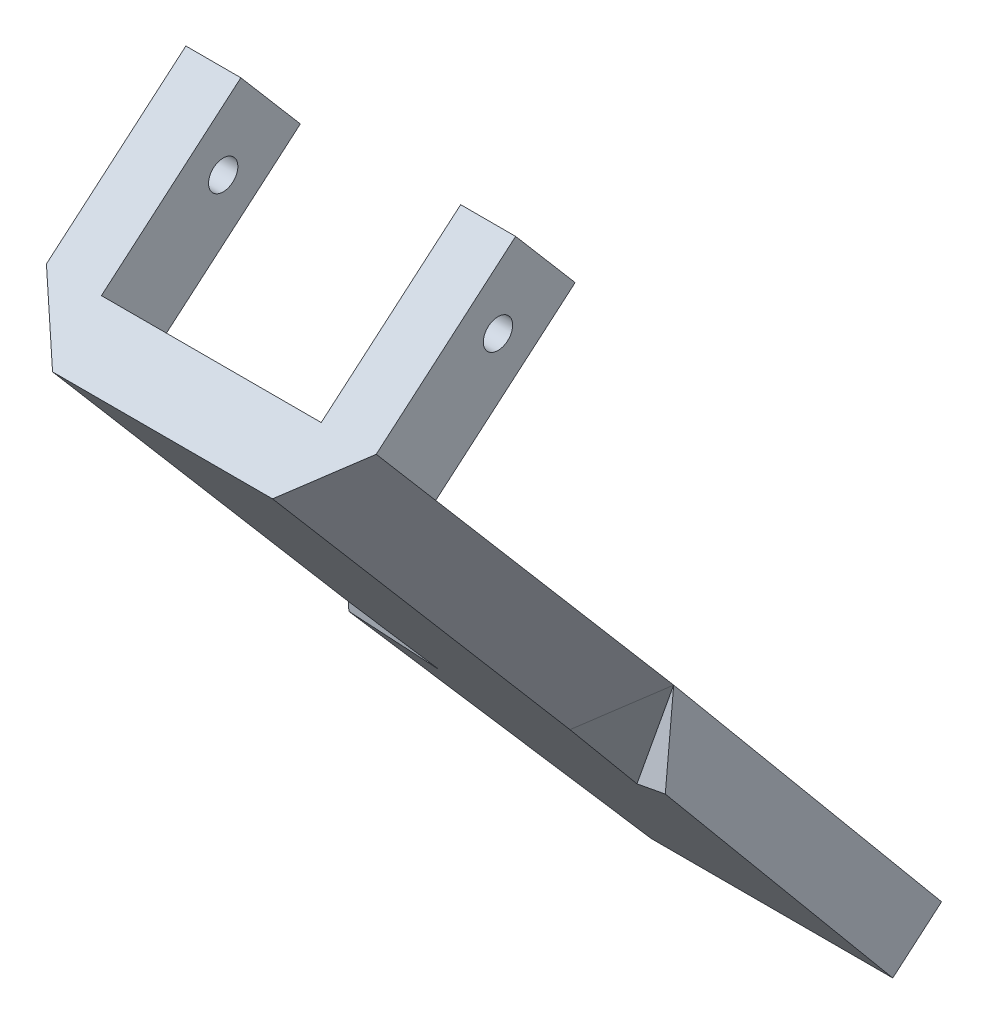
ISO-10303-21;
HEADER;
FILE_DESCRIPTION(('STEP AP214'),'2;1');
FILE_NAME('part.step','',(''),(''),'','','');
FILE_SCHEMA(('AUTOMOTIVE_DESIGN { 1 0 10303 214 1 1 1 1 }'));
ENDSEC;
DATA;
#1=APPLICATION_CONTEXT('core data for automotive mechanical design processes');
#2=APPLICATION_PROTOCOL_DEFINITION('international standard','automotive_design',2000,#1);
#3=PRODUCT_CONTEXT('',#1,'mechanical');
#4=PRODUCT('Part','Part','',(#3));
#5=PRODUCT_RELATED_PRODUCT_CATEGORY('part','',(#4));
#6=PRODUCT_DEFINITION_FORMATION('','',#4);
#7=PRODUCT_DEFINITION_CONTEXT('part definition',#1,'design');
#8=PRODUCT_DEFINITION('design','',#6,#7);
#9=PRODUCT_DEFINITION_SHAPE('','',#8);
#10=(LENGTH_UNIT() NAMED_UNIT(*) SI_UNIT(.MILLI.,.METRE.));
#11=(NAMED_UNIT(*) PLANE_ANGLE_UNIT() SI_UNIT($,.RADIAN.));
#12=(NAMED_UNIT(*) SI_UNIT($,.STERADIAN.) SOLID_ANGLE_UNIT());
#13=UNCERTAINTY_MEASURE_WITH_UNIT(LENGTH_MEASURE(1.E-05),#10,'distance_accuracy_value','');
#14=(GEOMETRIC_REPRESENTATION_CONTEXT(3) GLOBAL_UNCERTAINTY_ASSIGNED_CONTEXT((#13)) GLOBAL_UNIT_ASSIGNED_CONTEXT((#10,
#11,#12)) REPRESENTATION_CONTEXT('',''));
#15=CARTESIAN_POINT('',(0.,0.,0.));
#16=DIRECTION('',(0.,0.,1.));
#17=DIRECTION('',(1.,0.,0.));
#18=AXIS2_PLACEMENT_3D('',#15,#16,#17);
#19=CARTESIAN_POINT('',(2.25437314883265E-13,56.2791106650212,-65.9585803354128));
#20=DIRECTION('',(0.,0.649082267454743,-0.760718219892102));
#21=DIRECTION('',(0.,0.760718219892102,0.649082267454743));
#22=AXIS2_PLACEMENT_3D('',#19,#20,#21);
#23=PLANE('',#22);
#24=DIRECTION('',(1.,0.,0.));
#25=VECTOR('',#24,1.);
#26=CARTESIAN_POINT('',(-22.8498957354245,148.067169769134,12.3595142897139));
#27=LINE('',#26,#25);
#28=CARTESIAN_POINT('',(-22.8498957354245,148.067169769134,12.3595142897139));
#29=VERTEX_POINT('',#28);
#30=CARTESIAN_POINT('',(-15.2298957354245,148.067169769134,12.3595142897139));
#31=VERTEX_POINT('',#30);
#32=EDGE_CURVE('E173',#29,#31,#27,.T.);
#33=ORIENTED_EDGE('',*,*,#32,.T.);
#34=DIRECTION('',(0.,-0.760718219892102,-0.649082267454743));
#35=VECTOR('',#34,1.);
#36=CARTESIAN_POINT('',(-15.2298957354246,157.728291161764,20.6028590863891));
#37=LINE('',#36,#35);
#38=CARTESIAN_POINT('',(-15.2298957354246,157.728291161764,20.6028590863891));
#39=VERTEX_POINT('',#38);
#40=EDGE_CURVE('E162',#39,#31,#37,.T.);
#41=ORIENTED_EDGE('',*,*,#40,.F.);
#42=DIRECTION('',(-1.,0.,0.));
#43=VECTOR('',#42,1.);
#44=CARTESIAN_POINT('',(22.8498957354246,157.728291161764,20.602859086389));
#45=LINE('',#44,#43);
#46=CARTESIAN_POINT('',(15.2298957354245,157.728291161764,20.6028590863891));
#47=VERTEX_POINT('',#46);
#48=EDGE_CURVE('E200',#47,#39,#45,.T.);
#49=ORIENTED_EDGE('',*,*,#48,.F.);
#50=DIRECTION('',(0.,-0.760718219892102,-0.649082267454743));
#51=VECTOR('',#50,1.);
#52=CARTESIAN_POINT('',(15.2298957354246,157.728291161764,20.6028590863891));
#53=LINE('',#52,#51);
#54=CARTESIAN_POINT('',(15.2298957354245,148.067169769134,12.3595142897139));
#55=VERTEX_POINT('',#54);
#56=EDGE_CURVE('E48',#47,#55,#53,.T.);
#57=ORIENTED_EDGE('',*,*,#56,.T.);
#58=DIRECTION('',(-1.,0.,0.));
#59=VECTOR('',#58,1.);
#60=CARTESIAN_POINT('',(22.8498957354245,148.067169769134,12.3595142897139));
#61=LINE('',#60,#59);
#62=CARTESIAN_POINT('',(22.8498957354245,148.067169769134,12.3595142897139));
#63=VERTEX_POINT('',#62);
#64=EDGE_CURVE('E187',#63,#55,#61,.T.);
#65=ORIENTED_EDGE('',*,*,#64,.F.);
#66=DIRECTION('',(0.,-0.760718219892102,-0.649082267454743));
#67=VECTOR('',#66,1.);
#68=CARTESIAN_POINT('',(22.8498957354246,157.728291161764,20.602859086389));
#69=LINE('',#68,#67);
#70=CARTESIAN_POINT('',(22.8498957354244,109.422684198615,-20.6138648969872));
#71=VERTEX_POINT('',#70);
#72=EDGE_CURVE('E214',#63,#71,#69,.T.);
#73=ORIENTED_EDGE('',*,*,#72,.T.);
#74=DIRECTION('',(0.0915092330061485,0.757526419598083,0.646358866176937));
#75=VECTOR('',#74,1.);
#76=CARTESIAN_POINT('',(22.8498957354254,109.422684198615,-20.6138648969871));
#77=LINE('',#76,#75);
#78=CARTESIAN_POINT('',(16.7266814497109,58.7338472156024,-63.8640781602429));
#79=VERTEX_POINT('',#78);
#80=EDGE_CURVE('E258',#79,#71,#77,.T.);
#81=ORIENTED_EDGE('',*,*,#80,.F.);
#82=DIRECTION('',(1.,0.,0.));
#83=VECTOR('',#82,1.);
#84=CARTESIAN_POINT('',(16.7266814497109,58.7338472156024,-63.8640781602429));
#85=LINE('',#84,#83);
#86=CARTESIAN_POINT('',(-16.7266814497104,58.7338472156025,-63.8640781602429));
#87=VERTEX_POINT('',#86);
#88=EDGE_CURVE('E246',#87,#79,#85,.T.);
#89=ORIENTED_EDGE('',*,*,#88,.F.);
#90=DIRECTION('',(0.0915092330061399,-0.757526419598084,-0.646358866176937));
#91=VECTOR('',#90,1.);
#92=CARTESIAN_POINT('',(-16.7266814497104,58.7338472156025,-63.8640781602429));
#93=LINE('',#92,#91);
#94=CARTESIAN_POINT('',(-22.8498957354244,109.422684198615,-20.6138648969871));
#95=VERTEX_POINT('',#94);
#96=EDGE_CURVE('E251',#95,#87,#93,.T.);
#97=ORIENTED_EDGE('',*,*,#96,.F.);
#98=DIRECTION('',(0.,-0.760718219892102,-0.649082267454743));
#99=VECTOR('',#98,1.);
#100=CARTESIAN_POINT('',(-22.8498957354242,157.728291161764,20.6028590863891));
#101=LINE('',#100,#99);
#102=EDGE_CURVE('E221',#29,#95,#101,.T.);
#103=ORIENTED_EDGE('',*,*,#102,.F.);
#104=EDGE_LOOP('',(#33,#41,#49,#57,#65,#73,#81,#89,#97,#103));
#105=FACE_BOUND('',#104,.T.);
#106=ADVANCED_FACE('F33',(#105),#23,.T.);
#107=CARTESIAN_POINT('',(-16.7266814497104,52.9635058579299,-57.1012931854021));
#108=DIRECTION('',(0.995804227885496,0.0696127408361206,0.0593970204526718));
#109=DIRECTION('',(-0.0697358638010119,0.997565491233496,0.));
#110=AXIS2_PLACEMENT_3D('',#107,#108,#109);
#111=PLANE('',#110);
#112=DIRECTION('',(0.06869077560842,-0.997485765660008,0.0174276978394198));
#113=VECTOR('',#112,1.);
#114=CARTESIAN_POINT('',(-18.9962097439423,53.4617944316989,-19.6361371827098));
#115=LINE('',#114,#113);
#116=CARTESIAN_POINT('',(-21.9256431200386,96.0012485028407,-20.3793705974896));
#117=VERTEX_POINT('',#116);
#118=EDGE_CURVE('E244',#95,#117,#115,.T.);
#119=ORIENTED_EDGE('',*,*,#118,.F.);
#120=ORIENTED_EDGE('',*,*,#96,.T.);
#121=DIRECTION('',(0.,0.649082267454743,-0.760718219892102));
#122=VECTOR('',#121,1.);
#123=CARTESIAN_POINT('',(-16.7266814497104,52.9635058579299,-57.1012931854021));
#124=LINE('',#123,#122);
#125=CARTESIAN_POINT('',(-16.7266814497104,52.9635058579299,-57.1012931854021));
#126=VERTEX_POINT('',#125);
#127=EDGE_CURVE('E41',#126,#87,#124,.T.);
#128=ORIENTED_EDGE('',*,*,#127,.F.);
#129=DIRECTION('',(0.0915092330061399,-0.757526419598084,-0.646358866176937));
#130=VECTOR('',#129,1.);
#131=CARTESIAN_POINT('',(-16.7266814497104,52.9635058579299,-57.1012931854021));
#132=LINE('',#131,#130);
#133=EDGE_CURVE('E254',#117,#126,#132,.T.);
#134=ORIENTED_EDGE('',*,*,#133,.F.);
#135=EDGE_LOOP('',(#119,#120,#128,#134));
#136=FACE_BOUND('',#135,.T.);
#137=ADVANCED_FACE('F282',(#136),#111,.F.);
#138=CARTESIAN_POINT('',(2.01594543499979E-13,50.5087693073485,-59.195795360572));
#139=DIRECTION('',(0.,0.649082267454743,-0.760718219892102));
#140=DIRECTION('',(0.,0.760718219892102,0.649082267454743));
#141=AXIS2_PLACEMENT_3D('',#138,#139,#140);
#142=PLANE('',#141);
#143=DIRECTION('',(0.0915092330061485,0.757526419598083,0.646358866176937));
#144=VECTOR('',#143,1.);
#145=CARTESIAN_POINT('',(22.8498957354254,103.652342840942,-13.8510799221463));
#146=LINE('',#145,#144);
#147=CARTESIAN_POINT('',(16.7266814497108,52.9635058579297,-57.1012931854022));
#148=VERTEX_POINT('',#147);
#149=CARTESIAN_POINT('',(21.9256431200397,96.0012485028411,-20.3793705974891));
#150=VERTEX_POINT('',#149);
#151=EDGE_CURVE('E250',#148,#150,#146,.T.);
#152=ORIENTED_EDGE('',*,*,#151,.T.);
#153=DIRECTION('',(-0.778997045696113,-0.476991314620932,-0.406992492035078));
#154=VECTOR('',#153,1.);
#155=CARTESIAN_POINT('',(-20.5900853717178,69.9682444787655,-42.5920123336135));
#156=LINE('',#155,#154);
#157=CARTESIAN_POINT('',(13.7079003008858,90.9694040662268,-24.6727882007383));
#158=VERTEX_POINT('',#157);
#159=EDGE_CURVE('E56',#150,#158,#156,.T.);
#160=ORIENTED_EDGE('',*,*,#159,.T.);
#161=DIRECTION('',(-0.0915092330061396,-0.757526419598083,-0.646358866176937));
#162=VECTOR('',#161,1.);
#163=CARTESIAN_POINT('',(8.74639313406576,49.8973435055266,-59.7174939809668));
#164=LINE('',#163,#162);
#165=CARTESIAN_POINT('',(15.240000000001,103.652342840942,-13.8510799221463));
#166=VERTEX_POINT('',#165);
#167=EDGE_CURVE('E225',#166,#158,#164,.T.);
#168=ORIENTED_EDGE('',*,*,#167,.F.);
#169=DIRECTION('',(0.,-0.760718219892102,-0.649082267454743));
#170=VECTOR('',#169,1.);
#171=CARTESIAN_POINT('',(15.2400000000013,151.957949804091,27.3656440612299));
#172=LINE('',#171,#170);
#173=CARTESIAN_POINT('',(15.2400000000013,151.957949804091,27.3656440612299));
#174=VERTEX_POINT('',#173);
#175=EDGE_CURVE('E217',#174,#166,#172,.T.);
#176=ORIENTED_EDGE('',*,*,#175,.F.);
#177=DIRECTION('',(1.,0.,0.));
#178=VECTOR('',#177,1.);
#179=CARTESIAN_POINT('',(-15.2400000000008,151.957949804091,27.3656440612299));
#180=LINE('',#179,#178);
#181=CARTESIAN_POINT('',(-15.2400000000008,151.957949804091,27.3656440612299));
#182=VERTEX_POINT('',#181);
#183=EDGE_CURVE('E210',#182,#174,#180,.T.);
#184=ORIENTED_EDGE('',*,*,#183,.F.);
#185=DIRECTION('',(0.,-0.760718219892102,-0.649082267454743));
#186=VECTOR('',#185,1.);
#187=CARTESIAN_POINT('',(-15.2400000000008,151.957949804091,27.3656440612299));
#188=LINE('',#187,#186);
#189=CARTESIAN_POINT('',(-15.2400000000011,103.652342840943,-13.8510799221463));
#190=VERTEX_POINT('',#189);
#191=EDGE_CURVE('E219',#182,#190,#188,.T.);
#192=ORIENTED_EDGE('',*,*,#191,.T.);
#193=DIRECTION('',(-0.09150923300614,0.757526419598084,0.646358866176937));
#194=VECTOR('',#193,1.);
#195=CARTESIAN_POINT('',(-8.7463931340658,49.8973435055266,-59.7174939809668));
#196=LINE('',#195,#194);
#197=CARTESIAN_POINT('',(-13.7079003008859,90.969404066227,-24.6727882007382));
#198=VERTEX_POINT('',#197);
#199=EDGE_CURVE('E235',#198,#190,#196,.T.);
#200=ORIENTED_EDGE('',*,*,#199,.F.);
#201=DIRECTION('',(0.778997045696111,-0.476991314620936,-0.406992492035076));
#202=VECTOR('',#201,1.);
#203=CARTESIAN_POINT('',(20.5900853717181,69.9682444787651,-42.5920123336137));
#204=LINE('',#203,#202);
#205=EDGE_CURVE('E241',#117,#198,#204,.T.);
#206=ORIENTED_EDGE('',*,*,#205,.F.);
#207=ORIENTED_EDGE('',*,*,#133,.T.);
#208=DIRECTION('',(1.,0.,0.));
#209=VECTOR('',#208,1.);
#210=CARTESIAN_POINT('',(16.7266814497108,52.9635058579297,-57.1012931854022));
#211=LINE('',#210,#209);
#212=EDGE_CURVE('E247',#126,#148,#211,.T.);
#213=ORIENTED_EDGE('',*,*,#212,.T.);
#214=EDGE_LOOP('',(#152,#160,#168,#176,#184,#192,#200,#206,#207,#213));
#215=FACE_BOUND('',#214,.T.);
#216=ADVANCED_FACE('F278',(#215),#142,.F.);
#217=CARTESIAN_POINT('',(16.7266814497108,52.9635058579297,-57.1012931854022));
#218=DIRECTION('',(0.,0.760718219892102,0.649082267454743));
#219=DIRECTION('',(0.,-0.649082267454744,0.760718219892102));
#220=AXIS2_PLACEMENT_3D('',#217,#218,#219);
#221=PLANE('',#220);
#222=ORIENTED_EDGE('',*,*,#88,.T.);
#223=DIRECTION('',(0.,0.649082267454743,-0.760718219892102));
#224=VECTOR('',#223,1.);
#225=CARTESIAN_POINT('',(16.7266814497108,52.9635058579297,-57.1012931854022));
#226=LINE('',#225,#224);
#227=EDGE_CURVE('E11',#148,#79,#226,.T.);
#228=ORIENTED_EDGE('',*,*,#227,.F.);
#229=ORIENTED_EDGE('',*,*,#212,.F.);
#230=ORIENTED_EDGE('',*,*,#127,.T.);
#231=EDGE_LOOP('',(#222,#228,#229,#230));
#232=FACE_BOUND('',#231,.T.);
#233=ADVANCED_FACE('F35',(#232),#221,.F.);
#234=CARTESIAN_POINT('',(22.8498957354254,103.652342840942,-13.8510799221463));
#235=DIRECTION('',(-0.995804227885495,0.0696127408361306,0.0593970204526733));
#236=DIRECTION('',(-0.0697358638010219,-0.997565491233496,0.));
#237=AXIS2_PLACEMENT_3D('',#234,#235,#236);
#238=PLANE('',#237);
#239=ORIENTED_EDGE('',*,*,#80,.T.);
#240=DIRECTION('',(-0.0686907756084303,-0.997485765660007,0.017427697839414));
#241=VECTOR('',#240,1.);
#242=CARTESIAN_POINT('',(22.4464271979274,103.563758899239,-20.5114999477346));
#243=LINE('',#242,#241);
#244=EDGE_CURVE('E230',#71,#150,#243,.T.);
#245=ORIENTED_EDGE('',*,*,#244,.T.);
#246=ORIENTED_EDGE('',*,*,#151,.F.);
#247=ORIENTED_EDGE('',*,*,#227,.T.);
#248=EDGE_LOOP('',(#239,#245,#246,#247));
#249=FACE_BOUND('',#248,.T.);
#250=ADVANCED_FACE('F276',(#249),#238,.F.);
#251=CARTESIAN_POINT('',(-30.5495363149628,104.60637005904,-16.0592789602797));
#252=DIRECTION('',(0.485780442145663,0.0487006346480661,0.872723100538561));
#253=DIRECTION('',(0.873759886451557,0.,-0.486357544228689));
#254=AXIS2_PLACEMENT_3D('',#251,#252,#253);
#255=PLANE('',#254);
#256=ORIENTED_EDGE('',*,*,#118,.T.);
#257=ORIENTED_EDGE('',*,*,#205,.T.);
#258=DIRECTION('',(0.435543290820345,-0.879151867099546,-0.19337537691435));
#259=VECTOR('',#258,1.);
#260=CARTESIAN_POINT('',(-22.8498957354244,109.422684198615,-20.6138648969871));
#261=LINE('',#260,#259);
#262=EDGE_CURVE('E233',#95,#198,#261,.T.);
#263=ORIENTED_EDGE('',*,*,#262,.F.);
#264=EDGE_LOOP('',(#256,#257,#263));
#265=FACE_BOUND('',#264,.T.);
#266=ADVANCED_FACE('F285',(#265),#255,.T.);
#267=CARTESIAN_POINT('',(33.1901739491885,20.7612683261152,-19.6330592245527));
#268=DIRECTION('',(-0.757838639718343,-0.474046667281037,0.448286017392461));
#269=DIRECTION('',(0.530318690203662,-0.847798376278625,0.));
#270=AXIS2_PLACEMENT_3D('',#267,#268,#269);
#271=PLANE('',#270);
#272=DIRECTION('',(-0.65029348212856,0.493096818276274,-0.57790476283461));
#273=VECTOR('',#272,1.);
#274=CARTESIAN_POINT('',(-18.4580849825893,106.092514101252,-16.7109373399954));
#275=LINE('',#274,#273);
#276=EDGE_CURVE('E238',#190,#95,#275,.T.);
#277=ORIENTED_EDGE('',*,*,#276,.T.);
#278=ORIENTED_EDGE('',*,*,#262,.T.);
#279=ORIENTED_EDGE('',*,*,#199,.T.);
#280=EDGE_LOOP('',(#277,#278,#279));
#281=FACE_BOUND('',#280,.T.);
#282=ADVANCED_FACE('F287',(#281),#271,.T.);
#283=CARTESIAN_POINT('',(30.5495363149628,104.60637005904,-16.0592789602797));
#284=DIRECTION('',(0.485780442145663,-0.048700634648066,-0.872723100538561));
#285=DIRECTION('',(-0.873759886451557,0.,-0.486357544228689));
#286=AXIS2_PLACEMENT_3D('',#283,#284,#285);
#287=PLANE('',#286);
#288=ORIENTED_EDGE('',*,*,#244,.F.);
#289=DIRECTION('',(-0.435543290820345,-0.879151867099546,-0.19337537691435));
#290=VECTOR('',#289,1.);
#291=CARTESIAN_POINT('',(22.8498957354244,109.422684198615,-20.6138648969871));
#292=LINE('',#291,#290);
#293=EDGE_CURVE('E223',#71,#158,#292,.T.);
#294=ORIENTED_EDGE('',*,*,#293,.T.);
#295=ORIENTED_EDGE('',*,*,#159,.F.);
#296=EDGE_LOOP('',(#288,#294,#295));
#297=FACE_BOUND('',#296,.T.);
#298=ADVANCED_FACE('F442',(#297),#287,.F.);
#299=CARTESIAN_POINT('',(-33.1901739491885,20.7612683261152,-19.6330592245527));
#300=DIRECTION('',(0.757838639718343,-0.474046667281037,0.448286017392461));
#301=DIRECTION('',(-0.530318690203662,-0.847798376278625,0.));
#302=AXIS2_PLACEMENT_3D('',#299,#300,#301);
#303=PLANE('',#302);
#304=DIRECTION('',(-0.65029348212856,-0.493096818276271,0.577904762834613));
#305=VECTOR('',#304,1.);
#306=CARTESIAN_POINT('',(-0.867516543746109,91.4385265005783,0.463396208845427));
#307=LINE('',#306,#305);
#308=EDGE_CURVE('E227',#71,#166,#307,.T.);
#309=ORIENTED_EDGE('',*,*,#308,.T.);
#310=ORIENTED_EDGE('',*,*,#167,.T.);
#311=ORIENTED_EDGE('',*,*,#293,.F.);
#312=EDGE_LOOP('',(#309,#310,#311));
#313=FACE_BOUND('',#312,.T.);
#314=ADVANCED_FACE('F358',(#313),#303,.T.);
#315=CARTESIAN_POINT('',(-22.8498957354242,157.728291161764,20.6028590863891));
#316=DIRECTION('',(0.759683083332195,0.422093967891045,-0.494690100132278));
#317=DIRECTION('',(-0.545683042907748,0.,-0.837991656690531));
#318=AXIS2_PLACEMENT_3D('',#315,#316,#317);
#319=PLANE('',#318);
#320=ORIENTED_EDGE('',*,*,#276,.F.);
#321=ORIENTED_EDGE('',*,*,#191,.F.);
#322=DIRECTION('',(0.650293482128562,-0.493096818276274,0.577904762834609));
#323=VECTOR('',#322,1.);
#324=CARTESIAN_POINT('',(-22.8498957354242,157.728291161764,20.6028590863891));
#325=LINE('',#324,#323);
#326=CARTESIAN_POINT('',(-22.8498957354242,157.728291161764,20.6028590863891));
#327=VERTEX_POINT('',#326);
#328=EDGE_CURVE('E208',#327,#182,#325,.T.);
#329=ORIENTED_EDGE('',*,*,#328,.F.);
#330=EDGE_CURVE('E148',#327,#29,#101,.T.);
#331=ORIENTED_EDGE('',*,*,#330,.T.);
#332=ORIENTED_EDGE('',*,*,#102,.T.);
#333=EDGE_LOOP('',(#320,#321,#329,#331,#332));
#334=FACE_BOUND('',#333,.T.);
#335=ADVANCED_FACE('F291',(#334),#319,.F.);
#336=CARTESIAN_POINT('',(15.2400000000013,151.957949804091,27.3656440612299));
#337=DIRECTION('',(-0.759683083332196,0.422093967891049,-0.494690100132273));
#338=DIRECTION('',(-0.545683042907744,0.,0.837991656690534));
#339=AXIS2_PLACEMENT_3D('',#336,#337,#338);
#340=PLANE('',#339);
#341=ORIENTED_EDGE('',*,*,#308,.F.);
#342=ORIENTED_EDGE('',*,*,#72,.F.);
#343=CARTESIAN_POINT('',(22.8498957354246,157.728291161764,20.6028590863891));
#344=VERTEX_POINT('',#343);
#345=EDGE_CURVE('E215',#344,#63,#69,.T.);
#346=ORIENTED_EDGE('',*,*,#345,.F.);
#347=DIRECTION('',(0.65029348212856,0.493096818276271,-0.577904762834613));
#348=VECTOR('',#347,1.);
#349=CARTESIAN_POINT('',(15.2400000000013,151.957949804091,27.3656440612299));
#350=LINE('',#349,#348);
#351=EDGE_CURVE('E212',#174,#344,#350,.T.);
#352=ORIENTED_EDGE('',*,*,#351,.F.);
#353=ORIENTED_EDGE('',*,*,#175,.T.);
#354=EDGE_LOOP('',(#341,#342,#346,#352,#353));
#355=FACE_BOUND('',#354,.T.);
#356=ADVANCED_FACE('F368',(#355),#340,.F.);
#357=CARTESIAN_POINT('',(4.9873620637909E-13,101.449180496742,86.5614394218019));
#358=DIRECTION('',(0.,0.760718219892102,0.649082267454744));
#359=DIRECTION('',(0.,-0.649082267454744,0.760718219892102));
#360=AXIS2_PLACEMENT_3D('',#357,#358,#359);
#361=PLANE('',#360);
#362=ORIENTED_EDGE('',*,*,#351,.T.);
#363=DIRECTION('',(0.,-0.649082267454743,0.760718219892102));
#364=VECTOR('',#363,1.);
#365=CARTESIAN_POINT('',(22.8498957354247,174.214980755114,1.28061630112971));
#366=LINE('',#365,#364);
#367=CARTESIAN_POINT('',(22.8498957354247,174.214980755114,1.28061630112971));
#368=VERTEX_POINT('',#367);
#369=EDGE_CURVE('E198',#368,#344,#366,.T.);
#370=ORIENTED_EDGE('',*,*,#369,.F.);
#371=DIRECTION('',(-1.,0.,0.));
#372=VECTOR('',#371,1.);
#373=CARTESIAN_POINT('',(22.8498957354247,174.214980755114,1.28061630112971));
#374=LINE('',#373,#372);
#375=CARTESIAN_POINT('',(15.2298957354247,174.214980755114,1.28061630112972));
#376=VERTEX_POINT('',#375);
#377=EDGE_CURVE('E183',#368,#376,#374,.T.);
#378=ORIENTED_EDGE('',*,*,#377,.T.);
#379=DIRECTION('',(0.,-0.649082267454743,0.760718219892102));
#380=VECTOR('',#379,1.);
#381=CARTESIAN_POINT('',(15.2298957354247,174.214980755114,1.28061630112972));
#382=LINE('',#381,#380);
#383=EDGE_CURVE('E194',#376,#47,#382,.T.);
#384=ORIENTED_EDGE('',*,*,#383,.T.);
#385=ORIENTED_EDGE('',*,*,#48,.T.);
#386=DIRECTION('',(0.,-0.649082267454743,0.760718219892102));
#387=VECTOR('',#386,1.);
#388=CARTESIAN_POINT('',(-15.2298957354247,174.214980755114,1.28061630112972));
#389=LINE('',#388,#387);
#390=CARTESIAN_POINT('',(-15.2298957354247,174.214980755114,1.28061630112972));
#391=VERTEX_POINT('',#390);
#392=EDGE_CURVE('E160',#391,#39,#389,.T.);
#393=ORIENTED_EDGE('',*,*,#392,.F.);
#394=DIRECTION('',(1.,0.,0.));
#395=VECTOR('',#394,1.);
#396=CARTESIAN_POINT('',(-22.8498957354247,174.214980755114,1.28061630112971));
#397=LINE('',#396,#395);
#398=CARTESIAN_POINT('',(-22.8498957354247,174.214980755114,1.28061630112971));
#399=VERTEX_POINT('',#398);
#400=EDGE_CURVE('E156',#399,#391,#397,.T.);
#401=ORIENTED_EDGE('',*,*,#400,.F.);
#402=DIRECTION('',(0.,-0.649082267454743,0.760718219892102));
#403=VECTOR('',#402,1.);
#404=CARTESIAN_POINT('',(-22.8498957354247,174.214980755114,1.28061630112971));
#405=LINE('',#404,#403);
#406=EDGE_CURVE('E142',#399,#327,#405,.T.);
#407=ORIENTED_EDGE('',*,*,#406,.T.);
#408=ORIENTED_EDGE('',*,*,#328,.T.);
#409=ORIENTED_EDGE('',*,*,#183,.T.);
#410=EDGE_LOOP('',(#362,#370,#378,#384,#385,#393,#401,#407,#408,#409));
#411=FACE_BOUND('',#410,.T.);
#412=ADVANCED_FACE('F158',(#411),#361,.T.);
#413=CARTESIAN_POINT('',(22.8498957354247,174.214980755114,1.28061630112971));
#414=DIRECTION('',(-1.,0.,0.));
#415=DIRECTION('',(0.,-1.,0.));
#416=AXIS2_PLACEMENT_3D('',#413,#414,#415);
#417=PLANE('',#416);
#418=CARTESIAN_POINT('',(22.8498957354254,163.77894559706,3.72850644978027));
#419=DIRECTION('',(-1.,0.,0.));
#420=DIRECTION('',(0.,-1.,0.));
#421=AXIS2_PLACEMENT_3D('',#418,#419,#420);
#422=CIRCLE('',#421,2.03199999247914);
#423=CARTESIAN_POINT('',(22.8498957354254,161.746945604581,3.72850644978027));
#424=VERTEX_POINT('',#423);
#425=EDGE_CURVE('E475',#424,#424,#422,.T.);
#426=ORIENTED_EDGE('',*,*,#425,.T.);
#427=EDGE_LOOP('',(#426));
#428=FACE_BOUND('',#427,.T.);
#429=ORIENTED_EDGE('',*,*,#345,.T.);
#430=DIRECTION('',(0.,-0.649082267454743,0.760718219892102));
#431=VECTOR('',#430,1.);
#432=CARTESIAN_POINT('',(22.8498957354246,164.553859362484,-6.96272849554553));
#433=LINE('',#432,#431);
#434=CARTESIAN_POINT('',(22.8498957354246,164.553859362484,-6.96272849554553));
#435=VERTEX_POINT('',#434);
#436=EDGE_CURVE('E201',#435,#63,#433,.T.);
#437=ORIENTED_EDGE('',*,*,#436,.F.);
#438=DIRECTION('',(0.,-0.760718219892102,-0.649082267454743));
#439=VECTOR('',#438,1.);
#440=CARTESIAN_POINT('',(22.8498957354247,174.214980755114,1.28061630112971));
#441=LINE('',#440,#439);
#442=EDGE_CURVE('E192',#368,#435,#441,.T.);
#443=ORIENTED_EDGE('',*,*,#442,.F.);
#444=ORIENTED_EDGE('',*,*,#369,.T.);
#445=EDGE_LOOP('',(#429,#437,#443,#444));
#446=FACE_BOUND('',#445,.T.);
#447=ADVANCED_FACE('F385',(#428,#446),#417,.F.);
#448=CARTESIAN_POINT('',(22.8498957354246,164.553859362484,-6.96272849554553));
#449=DIRECTION('',(0.,0.760718219892102,0.649082267454743));
#450=DIRECTION('',(0.,-0.649082267454744,0.760718219892102));
#451=AXIS2_PLACEMENT_3D('',#448,#449,#450);
#452=PLANE('',#451);
#453=ORIENTED_EDGE('',*,*,#64,.T.);
#454=DIRECTION('',(0.,-0.649082267454743,0.760718219892102));
#455=VECTOR('',#454,1.);
#456=CARTESIAN_POINT('',(15.2298957354246,164.553859362484,-6.96272849554552));
#457=LINE('',#456,#455);
#458=CARTESIAN_POINT('',(15.2298957354246,164.553859362484,-6.96272849554552));
#459=VERTEX_POINT('',#458);
#460=EDGE_CURVE('E204',#459,#55,#457,.T.);
#461=ORIENTED_EDGE('',*,*,#460,.F.);
#462=DIRECTION('',(-1.,0.,0.));
#463=VECTOR('',#462,1.);
#464=CARTESIAN_POINT('',(22.8498957354246,164.553859362484,-6.96272849554553));
#465=LINE('',#464,#463);
#466=EDGE_CURVE('E190',#435,#459,#465,.T.);
#467=ORIENTED_EDGE('',*,*,#466,.F.);
#468=ORIENTED_EDGE('',*,*,#436,.T.);
#469=EDGE_LOOP('',(#453,#461,#467,#468));
#470=FACE_BOUND('',#469,.T.);
#471=ADVANCED_FACE('F400',(#470),#452,.F.);
#472=CARTESIAN_POINT('',(15.2298957354247,174.214980755114,1.28061630112972));
#473=DIRECTION('',(-1.,0.,0.));
#474=DIRECTION('',(0.,-1.,0.));
#475=AXIS2_PLACEMENT_3D('',#472,#473,#474);
#476=PLANE('',#475);
#477=CARTESIAN_POINT('',(15.2298957354246,163.77894559706,3.72850644978027));
#478=DIRECTION('',(-1.,0.,0.));
#479=DIRECTION('',(0.,-1.,0.));
#480=AXIS2_PLACEMENT_3D('',#477,#478,#479);
#481=CIRCLE('',#480,2.03199999247914);
#482=CARTESIAN_POINT('',(15.2298957354246,161.746945604581,3.72850644978027));
#483=VERTEX_POINT('',#482);
#484=EDGE_CURVE('E176',#483,#483,#481,.T.);
#485=ORIENTED_EDGE('',*,*,#484,.F.);
#486=EDGE_LOOP('',(#485));
#487=FACE_BOUND('',#486,.T.);
#488=ORIENTED_EDGE('',*,*,#56,.F.);
#489=ORIENTED_EDGE('',*,*,#383,.F.);
#490=DIRECTION('',(0.,-0.760718219892102,-0.649082267454743));
#491=VECTOR('',#490,1.);
#492=CARTESIAN_POINT('',(15.2298957354247,174.214980755114,1.28061630112972));
#493=LINE('',#492,#491);
#494=EDGE_CURVE('E186',#376,#459,#493,.T.);
#495=ORIENTED_EDGE('',*,*,#494,.T.);
#496=ORIENTED_EDGE('',*,*,#460,.T.);
#497=EDGE_LOOP('',(#488,#489,#495,#496));
#498=FACE_BOUND('',#497,.T.);
#499=ADVANCED_FACE('F310',(#487,#498),#476,.T.);
#500=CARTESIAN_POINT('',(3.55904147563323E-13,72.7658002583717,-85.2808231206722));
#501=DIRECTION('',(0.,-0.649082267454743,0.760718219892103));
#502=DIRECTION('',(0.,-0.760718219892103,-0.649082267454743));
#503=AXIS2_PLACEMENT_3D('',#500,#501,#502);
#504=PLANE('',#503);
#505=ORIENTED_EDGE('',*,*,#377,.F.);
#506=ORIENTED_EDGE('',*,*,#442,.T.);
#507=ORIENTED_EDGE('',*,*,#466,.T.);
#508=ORIENTED_EDGE('',*,*,#494,.F.);
#509=EDGE_LOOP('',(#505,#506,#507,#508));
#510=FACE_BOUND('',#509,.T.);
#511=ADVANCED_FACE('F302',(#510),#504,.F.);
#512=CARTESIAN_POINT('',(-15.2298957354247,174.214980755114,1.28061630112972));
#513=DIRECTION('',(-1.,0.,0.));
#514=DIRECTION('',(0.,-1.,0.));
#515=AXIS2_PLACEMENT_3D('',#512,#513,#514);
#516=PLANE('',#515);
#517=CARTESIAN_POINT('',(-15.2298957354246,163.77894559706,3.72850644978027));
#518=DIRECTION('',(-1.,0.,0.));
#519=DIRECTION('',(0.,-1.,0.));
#520=AXIS2_PLACEMENT_3D('',#517,#518,#519);
#521=CIRCLE('',#520,2.03199999247914);
#522=CARTESIAN_POINT('',(-15.2298957354246,161.746945604581,3.72850644978027));
#523=VERTEX_POINT('',#522);
#524=EDGE_CURVE('E478',#523,#523,#521,.T.);
#525=ORIENTED_EDGE('',*,*,#524,.T.);
#526=EDGE_LOOP('',(#525));
#527=FACE_BOUND('',#526,.T.);
#528=ORIENTED_EDGE('',*,*,#40,.T.);
#529=DIRECTION('',(0.,-0.649082267454743,0.760718219892102));
#530=VECTOR('',#529,1.);
#531=CARTESIAN_POINT('',(-15.2298957354246,164.553859362484,-6.96272849554552));
#532=LINE('',#531,#530);
#533=CARTESIAN_POINT('',(-15.2298957354246,164.553859362484,-6.96272849554552));
#534=VERTEX_POINT('',#533);
#535=EDGE_CURVE('E180',#534,#31,#532,.T.);
#536=ORIENTED_EDGE('',*,*,#535,.F.);
#537=DIRECTION('',(0.,-0.760718219892102,-0.649082267454743));
#538=VECTOR('',#537,1.);
#539=CARTESIAN_POINT('',(-15.2298957354247,174.214980755114,1.28061630112972));
#540=LINE('',#539,#538);
#541=EDGE_CURVE('E152',#391,#534,#540,.T.);
#542=ORIENTED_EDGE('',*,*,#541,.F.);
#543=ORIENTED_EDGE('',*,*,#392,.T.);
#544=EDGE_LOOP('',(#528,#536,#542,#543));
#545=FACE_BOUND('',#544,.T.);
#546=ADVANCED_FACE('F300',(#527,#545),#516,.F.);
#547=CARTESIAN_POINT('',(-22.8498957354246,164.553859362484,-6.96272849554553));
#548=DIRECTION('',(0.,-0.760718219892102,-0.649082267454743));
#549=DIRECTION('',(0.,0.649082267454744,-0.760718219892102));
#550=AXIS2_PLACEMENT_3D('',#547,#548,#549);
#551=PLANE('',#550);
#552=ORIENTED_EDGE('',*,*,#32,.F.);
#553=DIRECTION('',(0.,-0.649082267454743,0.760718219892102));
#554=VECTOR('',#553,1.);
#555=CARTESIAN_POINT('',(-22.8498957354246,164.553859362484,-6.96272849554553));
#556=LINE('',#555,#554);
#557=CARTESIAN_POINT('',(-22.8498957354246,164.553859362484,-6.96272849554553));
#558=VERTEX_POINT('',#557);
#559=EDGE_CURVE('E151',#558,#29,#556,.T.);
#560=ORIENTED_EDGE('',*,*,#559,.F.);
#561=DIRECTION('',(1.,0.,0.));
#562=VECTOR('',#561,1.);
#563=CARTESIAN_POINT('',(-22.8498957354246,164.553859362484,-6.96272849554553));
#564=LINE('',#563,#562);
#565=EDGE_CURVE('E167',#558,#534,#564,.T.);
#566=ORIENTED_EDGE('',*,*,#565,.T.);
#567=ORIENTED_EDGE('',*,*,#535,.T.);
#568=EDGE_LOOP('',(#552,#560,#566,#567));
#569=FACE_BOUND('',#568,.T.);
#570=ADVANCED_FACE('F297',(#569),#551,.T.);
#571=CARTESIAN_POINT('',(-22.8498957354247,174.214980755114,1.28061630112971));
#572=DIRECTION('',(-1.,0.,0.));
#573=DIRECTION('',(0.,-1.,0.));
#574=AXIS2_PLACEMENT_3D('',#571,#572,#573);
#575=PLANE('',#574);
#576=CARTESIAN_POINT('',(-22.8498957354235,163.77894559706,3.72850644978027));
#577=DIRECTION('',(-1.,0.,0.));
#578=DIRECTION('',(0.,-1.,0.));
#579=AXIS2_PLACEMENT_3D('',#576,#577,#578);
#580=CIRCLE('',#579,2.03199999247914);
#581=CARTESIAN_POINT('',(-22.8498957354235,161.746945604581,3.72850644978027));
#582=VERTEX_POINT('',#581);
#583=EDGE_CURVE('E473',#582,#582,#580,.T.);
#584=ORIENTED_EDGE('',*,*,#583,.F.);
#585=EDGE_LOOP('',(#584));
#586=FACE_BOUND('',#585,.T.);
#587=ORIENTED_EDGE('',*,*,#330,.F.);
#588=ORIENTED_EDGE('',*,*,#406,.F.);
#589=DIRECTION('',(0.,-0.760718219892102,-0.649082267454743));
#590=VECTOR('',#589,1.);
#591=CARTESIAN_POINT('',(-22.8498957354247,174.214980755114,1.28061630112971));
#592=LINE('',#591,#590);
#593=EDGE_CURVE('E146',#399,#558,#592,.T.);
#594=ORIENTED_EDGE('',*,*,#593,.T.);
#595=ORIENTED_EDGE('',*,*,#559,.T.);
#596=EDGE_LOOP('',(#587,#588,#594,#595));
#597=FACE_BOUND('',#596,.T.);
#598=ADVANCED_FACE('F144',(#586,#597),#575,.T.);
#599=CARTESIAN_POINT('',(-3.7105925585967E-13,72.7658002583717,-85.2808231206722));
#600=DIRECTION('',(0.,-0.649082267454743,0.760718219892103));
#601=DIRECTION('',(0.,-0.760718219892103,-0.649082267454743));
#602=AXIS2_PLACEMENT_3D('',#599,#600,#601);
#603=PLANE('',#602);
#604=ORIENTED_EDGE('',*,*,#400,.T.);
#605=ORIENTED_EDGE('',*,*,#541,.T.);
#606=ORIENTED_EDGE('',*,*,#565,.F.);
#607=ORIENTED_EDGE('',*,*,#593,.F.);
#608=EDGE_LOOP('',(#604,#605,#606,#607));
#609=FACE_BOUND('',#608,.T.);
#610=ADVANCED_FACE('F165',(#609),#603,.F.);
#611=CARTESIAN_POINT('',(22.8498957354254,163.77894559706,3.72850644978027));
#612=DIRECTION('',(-1.,0.,0.));
#613=DIRECTION('',(0.,-1.,0.));
#614=AXIS2_PLACEMENT_3D('',#611,#612,#613);
#615=CYLINDRICAL_SURFACE('',#614,2.03199999247914);
#616=ORIENTED_EDGE('',*,*,#583,.T.);
#617=EDGE_LOOP('',(#616));
#618=FACE_BOUND('',#617,.T.);
#619=ORIENTED_EDGE('',*,*,#524,.F.);
#620=EDGE_LOOP('',(#619));
#621=FACE_BOUND('',#620,.T.);
#622=ADVANCED_FACE('F470',(#618,#621),#615,.F.);
#623=ORIENTED_EDGE('',*,*,#484,.T.);
#624=EDGE_LOOP('',(#623));
#625=FACE_BOUND('',#624,.T.);
#626=ORIENTED_EDGE('',*,*,#425,.F.);
#627=EDGE_LOOP('',(#626));
#628=FACE_BOUND('',#627,.T.);
#629=ADVANCED_FACE('F484',(#625,#628),#615,.F.);
#630=CLOSED_SHELL('',(#106,#137,#216,#233,#250,#266,#282,#298,#314,#335,#356,#412,#447,#471,
#499,#511,#546,#570,#598,#610,#622,#629));
#631=MANIFOLD_SOLID_BREP('B2',#630);
#632=ADVANCED_BREP_SHAPE_REPRESENTATION('',(#18,#631),#14);
#633=SHAPE_DEFINITION_REPRESENTATION(#9,#632);
ENDSEC;
END-ISO-10303-21;
